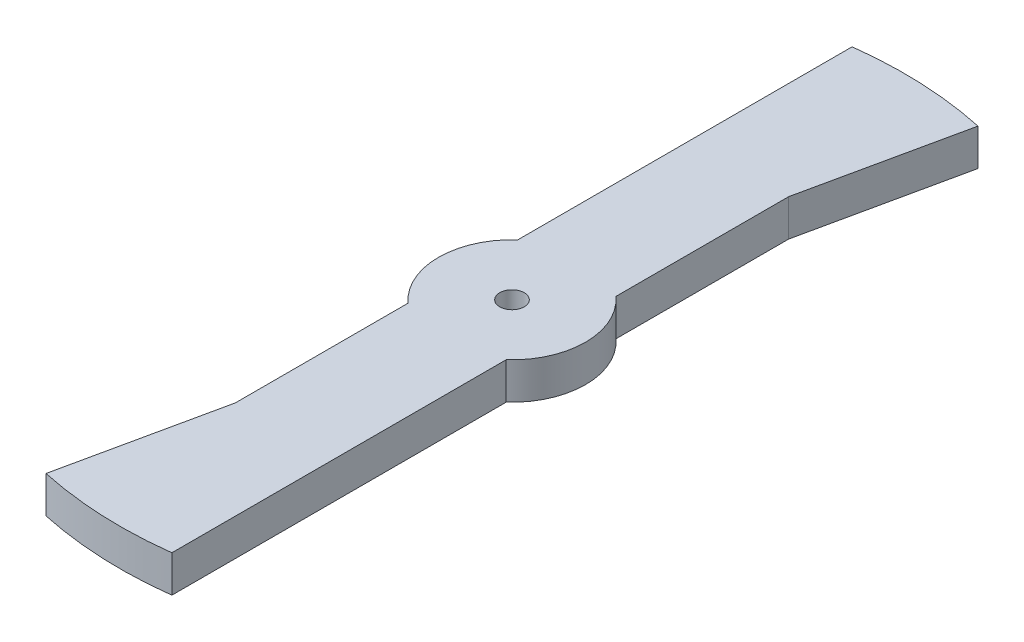
ISO-10303-21;
HEADER;
FILE_DESCRIPTION(('STEP AP214'),'2;1');
FILE_NAME('part.step','',(''),(''),'','','');
FILE_SCHEMA(('AUTOMOTIVE_DESIGN { 1 0 10303 214 1 1 1 1 }'));
ENDSEC;
DATA;
#1=APPLICATION_CONTEXT('core data for automotive mechanical design processes');
#2=APPLICATION_PROTOCOL_DEFINITION('international standard','automotive_design',2000,#1);
#3=PRODUCT_CONTEXT('',#1,'mechanical');
#4=PRODUCT('Part','Part','',(#3));
#5=PRODUCT_RELATED_PRODUCT_CATEGORY('part','',(#4));
#6=PRODUCT_DEFINITION_FORMATION('','',#4);
#7=PRODUCT_DEFINITION_CONTEXT('part definition',#1,'design');
#8=PRODUCT_DEFINITION('design','',#6,#7);
#9=PRODUCT_DEFINITION_SHAPE('','',#8);
#10=(LENGTH_UNIT() NAMED_UNIT(*) SI_UNIT(.MILLI.,.METRE.));
#11=(NAMED_UNIT(*) PLANE_ANGLE_UNIT() SI_UNIT($,.RADIAN.));
#12=(NAMED_UNIT(*) SI_UNIT($,.STERADIAN.) SOLID_ANGLE_UNIT());
#13=UNCERTAINTY_MEASURE_WITH_UNIT(LENGTH_MEASURE(1.E-05),#10,'distance_accuracy_value','');
#14=(GEOMETRIC_REPRESENTATION_CONTEXT(3) GLOBAL_UNCERTAINTY_ASSIGNED_CONTEXT((#13)) GLOBAL_UNIT_ASSIGNED_CONTEXT((#10,
#11,#12)) REPRESENTATION_CONTEXT('',''));
#15=CARTESIAN_POINT('',(0.,0.,0.));
#16=DIRECTION('',(0.,0.,1.));
#17=DIRECTION('',(1.,0.,0.));
#18=AXIS2_PLACEMENT_3D('',#15,#16,#17);
#19=CARTESIAN_POINT('',(0.,9.525,0.));
#20=DIRECTION('',(0.,-1.,0.));
#21=DIRECTION('',(0.,0.,-1.));
#22=AXIS2_PLACEMENT_3D('',#19,#20,#21);
#23=CYLINDRICAL_SURFACE('',#22,19.05);
#24=CARTESIAN_POINT('',(0.,0.,0.));
#25=DIRECTION('',(0.,1.,0.));
#26=DIRECTION('',(0.,0.,1.));
#27=AXIS2_PLACEMENT_3D('',#24,#25,#26);
#28=CIRCLE('',#27,19.05);
#29=CARTESIAN_POINT('',(12.7,0.,-14.1990316571237));
#30=VERTEX_POINT('',#29);
#31=CARTESIAN_POINT('',(12.6999999999999,0.,14.1990316571238));
#32=VERTEX_POINT('',#31);
#33=EDGE_CURVE('E149',#30,#32,#28,.F.);
#34=ORIENTED_EDGE('',*,*,#33,.F.);
#35=DIRECTION('',(0.,-1.,0.));
#36=VECTOR('',#35,1.);
#37=CARTESIAN_POINT('',(12.7,9.525,-14.1990316571237));
#38=LINE('',#37,#36);
#39=CARTESIAN_POINT('',(12.7,9.525,-14.1990316571237));
#40=VERTEX_POINT('',#39);
#41=EDGE_CURVE('E11',#40,#30,#38,.T.);
#42=ORIENTED_EDGE('',*,*,#41,.F.);
#43=CARTESIAN_POINT('',(0.,9.525,0.));
#44=DIRECTION('',(0.,1.,0.));
#45=DIRECTION('',(0.,0.,1.));
#46=AXIS2_PLACEMENT_3D('',#43,#44,#45);
#47=CIRCLE('',#46,19.05);
#48=CARTESIAN_POINT('',(12.6999999999999,9.525,14.1990316571238));
#49=VERTEX_POINT('',#48);
#50=EDGE_CURVE('E174',#40,#49,#47,.F.);
#51=ORIENTED_EDGE('',*,*,#50,.T.);
#52=DIRECTION('',(0.,-1.,0.));
#53=VECTOR('',#52,1.);
#54=CARTESIAN_POINT('',(12.6999999999999,9.525,14.1990316571238));
#55=LINE('',#54,#53);
#56=EDGE_CURVE('E95',#49,#32,#55,.T.);
#57=ORIENTED_EDGE('',*,*,#56,.T.);
#58=EDGE_LOOP('',(#34,#42,#51,#57));
#59=FACE_BOUND('',#58,.T.);
#60=ADVANCED_FACE('F39',(#59),#23,.T.);
#61=CARTESIAN_POINT('',(12.7,9.525,0.));
#62=DIRECTION('',(-1.,0.,0.));
#63=DIRECTION('',(0.,0.,1.));
#64=AXIS2_PLACEMENT_3D('',#61,#62,#63);
#65=PLANE('',#64);
#66=DIRECTION('',(0.,0.,-1.));
#67=VECTOR('',#66,1.);
#68=CARTESIAN_POINT('',(12.7,0.,0.));
#69=LINE('',#68,#67);
#70=CARTESIAN_POINT('',(12.7,0.,-58.9730075966963));
#71=VERTEX_POINT('',#70);
#72=EDGE_CURVE('E152',#30,#71,#69,.T.);
#73=ORIENTED_EDGE('',*,*,#72,.T.);
#74=DIRECTION('',(0.,-1.,0.));
#75=VECTOR('',#74,1.);
#76=CARTESIAN_POINT('',(12.7,9.525,-58.9730075966963));
#77=LINE('',#76,#75);
#78=CARTESIAN_POINT('',(12.7,9.525,-58.9730075966963));
#79=VERTEX_POINT('',#78);
#80=EDGE_CURVE('E47',#79,#71,#77,.T.);
#81=ORIENTED_EDGE('',*,*,#80,.F.);
#82=DIRECTION('',(0.,0.,-1.));
#83=VECTOR('',#82,1.);
#84=CARTESIAN_POINT('',(12.7,9.525,0.));
#85=LINE('',#84,#83);
#86=EDGE_CURVE('E213',#40,#79,#85,.T.);
#87=ORIENTED_EDGE('',*,*,#86,.F.);
#88=ORIENTED_EDGE('',*,*,#41,.T.);
#89=EDGE_LOOP('',(#73,#81,#87,#88));
#90=FACE_BOUND('',#89,.T.);
#91=ADVANCED_FACE('F227',(#90),#65,.F.);
#92=CARTESIAN_POINT('',(0.,9.525,0.));
#93=DIRECTION('',(-0.9775881905793,0.,-0.210526315789475));
#94=DIRECTION('',(-0.210526315789475,0.,0.9775881905793));
#95=AXIS2_PLACEMENT_3D('',#92,#93,#94);
#96=PLANE('',#95);
#97=DIRECTION('',(0.210526315789475,0.,-0.9775881905793));
#98=VECTOR('',#97,1.);
#99=CARTESIAN_POINT('',(0.,0.,0.));
#100=LINE('',#99,#98);
#101=CARTESIAN_POINT('',(21.3894736842106,0.,-99.3229601628569));
#102=VERTEX_POINT('',#101);
#103=EDGE_CURVE('E154',#71,#102,#100,.T.);
#104=ORIENTED_EDGE('',*,*,#103,.T.);
#105=DIRECTION('',(0.,-1.,0.));
#106=VECTOR('',#105,1.);
#107=CARTESIAN_POINT('',(21.3894736842106,9.525,-99.3229601628569));
#108=LINE('',#107,#106);
#109=CARTESIAN_POINT('',(21.3894736842106,9.525,-99.3229601628569));
#110=VERTEX_POINT('',#109);
#111=EDGE_CURVE('E186',#110,#102,#108,.T.);
#112=ORIENTED_EDGE('',*,*,#111,.F.);
#113=DIRECTION('',(0.210526315789475,0.,-0.9775881905793));
#114=VECTOR('',#113,1.);
#115=CARTESIAN_POINT('',(0.,9.525,0.));
#116=LINE('',#115,#114);
#117=EDGE_CURVE('E194',#79,#110,#116,.T.);
#118=ORIENTED_EDGE('',*,*,#117,.F.);
#119=ORIENTED_EDGE('',*,*,#80,.T.);
#120=EDGE_LOOP('',(#104,#112,#118,#119));
#121=FACE_BOUND('',#120,.T.);
#122=ADVANCED_FACE('F192',(#121),#96,.F.);
#123=CARTESIAN_POINT('',(0.,9.525,0.));
#124=DIRECTION('',(0.,-1.,0.));
#125=DIRECTION('',(0.,0.,-1.));
#126=AXIS2_PLACEMENT_3D('',#123,#124,#125);
#127=CYLINDRICAL_SURFACE('',#126,101.6);
#128=CARTESIAN_POINT('',(0.,0.,0.));
#129=DIRECTION('',(0.,1.,0.));
#130=DIRECTION('',(0.,0.,1.));
#131=AXIS2_PLACEMENT_3D('',#128,#129,#130);
#132=CIRCLE('',#131,101.6);
#133=CARTESIAN_POINT('',(-12.7,0.,-100.803124951561));
#134=VERTEX_POINT('',#133);
#135=EDGE_CURVE('E157',#134,#102,#132,.F.);
#136=ORIENTED_EDGE('',*,*,#135,.F.);
#137=DIRECTION('',(0.,-1.,0.));
#138=VECTOR('',#137,1.);
#139=CARTESIAN_POINT('',(-12.7,9.525,-100.803124951561));
#140=LINE('',#139,#138);
#141=CARTESIAN_POINT('',(-12.7,9.525,-100.803124951561));
#142=VERTEX_POINT('',#141);
#143=EDGE_CURVE('E184',#142,#134,#140,.T.);
#144=ORIENTED_EDGE('',*,*,#143,.F.);
#145=CARTESIAN_POINT('',(0.,9.525,0.));
#146=DIRECTION('',(0.,1.,0.));
#147=DIRECTION('',(0.,0.,1.));
#148=AXIS2_PLACEMENT_3D('',#145,#146,#147);
#149=CIRCLE('',#148,101.6);
#150=EDGE_CURVE('E208',#142,#110,#149,.F.);
#151=ORIENTED_EDGE('',*,*,#150,.T.);
#152=ORIENTED_EDGE('',*,*,#111,.T.);
#153=EDGE_LOOP('',(#136,#144,#151,#152));
#154=FACE_BOUND('',#153,.T.);
#155=ADVANCED_FACE('F204',(#154),#127,.T.);
#156=CARTESIAN_POINT('',(-12.7,9.525,0.));
#157=DIRECTION('',(1.,0.,0.));
#158=DIRECTION('',(0.,0.,-1.));
#159=AXIS2_PLACEMENT_3D('',#156,#157,#158);
#160=PLANE('',#159);
#161=DIRECTION('',(0.,0.,1.));
#162=VECTOR('',#161,1.);
#163=CARTESIAN_POINT('',(-12.7,0.,0.));
#164=LINE('',#163,#162);
#165=CARTESIAN_POINT('',(-12.7,0.,-14.1990316571237));
#166=VERTEX_POINT('',#165);
#167=EDGE_CURVE('E160',#134,#166,#164,.T.);
#168=ORIENTED_EDGE('',*,*,#167,.T.);
#169=DIRECTION('',(0.,-1.,0.));
#170=VECTOR('',#169,1.);
#171=CARTESIAN_POINT('',(-12.7,9.525,-14.1990316571237));
#172=LINE('',#171,#170);
#173=CARTESIAN_POINT('',(-12.7,9.525,-14.1990316571237));
#174=VERTEX_POINT('',#173);
#175=EDGE_CURVE('E181',#174,#166,#172,.T.);
#176=ORIENTED_EDGE('',*,*,#175,.F.);
#177=DIRECTION('',(0.,0.,1.));
#178=VECTOR('',#177,1.);
#179=CARTESIAN_POINT('',(-12.7,9.525,0.));
#180=LINE('',#179,#178);
#181=EDGE_CURVE('E209',#142,#174,#180,.T.);
#182=ORIENTED_EDGE('',*,*,#181,.F.);
#183=ORIENTED_EDGE('',*,*,#143,.T.);
#184=EDGE_LOOP('',(#168,#176,#182,#183));
#185=FACE_BOUND('',#184,.T.);
#186=ADVANCED_FACE('F237',(#185),#160,.F.);
#187=CARTESIAN_POINT('',(0.,9.525,0.));
#188=DIRECTION('',(0.,-1.,0.));
#189=DIRECTION('',(0.,0.,-1.));
#190=AXIS2_PLACEMENT_3D('',#187,#188,#189);
#191=CYLINDRICAL_SURFACE('',#190,19.05);
#192=CARTESIAN_POINT('',(0.,0.,0.));
#193=DIRECTION('',(0.,1.,0.));
#194=DIRECTION('',(0.,0.,1.));
#195=AXIS2_PLACEMENT_3D('',#192,#193,#194);
#196=CIRCLE('',#195,19.05);
#197=CARTESIAN_POINT('',(-12.7000000000001,0.,14.1990316571236));
#198=VERTEX_POINT('',#197);
#199=EDGE_CURVE('E162',#166,#198,#196,.T.);
#200=ORIENTED_EDGE('',*,*,#199,.T.);
#201=DIRECTION('',(0.,-1.,0.));
#202=VECTOR('',#201,1.);
#203=CARTESIAN_POINT('',(-12.7000000000001,9.525,14.1990316571236));
#204=LINE('',#203,#202);
#205=CARTESIAN_POINT('',(-12.7000000000001,9.525,14.1990316571236));
#206=VERTEX_POINT('',#205);
#207=EDGE_CURVE('E178',#206,#198,#204,.T.);
#208=ORIENTED_EDGE('',*,*,#207,.F.);
#209=CARTESIAN_POINT('',(0.,9.525,0.));
#210=DIRECTION('',(0.,1.,0.));
#211=DIRECTION('',(0.,0.,1.));
#212=AXIS2_PLACEMENT_3D('',#209,#210,#211);
#213=CIRCLE('',#212,19.05);
#214=EDGE_CURVE('E211',#174,#206,#213,.T.);
#215=ORIENTED_EDGE('',*,*,#214,.F.);
#216=ORIENTED_EDGE('',*,*,#175,.T.);
#217=EDGE_LOOP('',(#200,#208,#215,#216));
#218=FACE_BOUND('',#217,.T.);
#219=ADVANCED_FACE('F221',(#218),#191,.T.);
#220=CARTESIAN_POINT('',(-12.7000000000001,9.525,0.));
#221=DIRECTION('',(1.,0.,0.));
#222=DIRECTION('',(0.,0.,-1.));
#223=AXIS2_PLACEMENT_3D('',#220,#221,#222);
#224=PLANE('',#223);
#225=DIRECTION('',(0.,0.,1.));
#226=VECTOR('',#225,1.);
#227=CARTESIAN_POINT('',(-12.7000000000001,0.,0.));
#228=LINE('',#227,#226);
#229=CARTESIAN_POINT('',(-12.7,0.,58.9730075966963));
#230=VERTEX_POINT('',#229);
#231=EDGE_CURVE('E164',#198,#230,#228,.T.);
#232=ORIENTED_EDGE('',*,*,#231,.T.);
#233=DIRECTION('',(0.,-1.,0.));
#234=VECTOR('',#233,1.);
#235=CARTESIAN_POINT('',(-12.7,9.525,58.9730075966963));
#236=LINE('',#235,#234);
#237=CARTESIAN_POINT('',(-12.7,9.525,58.9730075966963));
#238=VERTEX_POINT('',#237);
#239=EDGE_CURVE('E139',#238,#230,#236,.T.);
#240=ORIENTED_EDGE('',*,*,#239,.F.);
#241=DIRECTION('',(0.,0.,1.));
#242=VECTOR('',#241,1.);
#243=CARTESIAN_POINT('',(-12.7000000000001,9.525,0.));
#244=LINE('',#243,#242);
#245=EDGE_CURVE('E126',#206,#238,#244,.T.);
#246=ORIENTED_EDGE('',*,*,#245,.F.);
#247=ORIENTED_EDGE('',*,*,#207,.T.);
#248=EDGE_LOOP('',(#232,#240,#246,#247));
#249=FACE_BOUND('',#248,.T.);
#250=ADVANCED_FACE('F224',(#249),#224,.F.);
#251=CARTESIAN_POINT('',(0.,9.525,0.));
#252=DIRECTION('',(0.9775881905793,0.,0.210526315789475));
#253=DIRECTION('',(0.210526315789475,0.,-0.9775881905793));
#254=AXIS2_PLACEMENT_3D('',#251,#252,#253);
#255=PLANE('',#254);
#256=DIRECTION('',(-0.210526315789475,0.,0.9775881905793));
#257=VECTOR('',#256,1.);
#258=CARTESIAN_POINT('',(0.,0.,0.));
#259=LINE('',#258,#257);
#260=CARTESIAN_POINT('',(-21.3894736842106,0.,99.3229601628569));
#261=VERTEX_POINT('',#260);
#262=EDGE_CURVE('E135',#230,#261,#259,.T.);
#263=ORIENTED_EDGE('',*,*,#262,.T.);
#264=DIRECTION('',(0.,-1.,0.));
#265=VECTOR('',#264,1.);
#266=CARTESIAN_POINT('',(-21.3894736842106,9.525,99.3229601628569));
#267=LINE('',#266,#265);
#268=CARTESIAN_POINT('',(-21.3894736842106,9.525,99.3229601628569));
#269=VERTEX_POINT('',#268);
#270=EDGE_CURVE('E132',#269,#261,#267,.T.);
#271=ORIENTED_EDGE('',*,*,#270,.F.);
#272=DIRECTION('',(-0.210526315789475,0.,0.9775881905793));
#273=VECTOR('',#272,1.);
#274=CARTESIAN_POINT('',(0.,9.525,0.));
#275=LINE('',#274,#273);
#276=EDGE_CURVE('E119',#238,#269,#275,.T.);
#277=ORIENTED_EDGE('',*,*,#276,.F.);
#278=ORIENTED_EDGE('',*,*,#239,.T.);
#279=EDGE_LOOP('',(#263,#271,#277,#278));
#280=FACE_BOUND('',#279,.T.);
#281=ADVANCED_FACE('F133',(#280),#255,.F.);
#282=CARTESIAN_POINT('',(0.,9.525,0.));
#283=DIRECTION('',(0.,-1.,0.));
#284=DIRECTION('',(0.,0.,-1.));
#285=AXIS2_PLACEMENT_3D('',#282,#283,#284);
#286=CYLINDRICAL_SURFACE('',#285,101.6);
#287=CARTESIAN_POINT('',(0.,0.,0.));
#288=DIRECTION('',(0.,1.,0.));
#289=DIRECTION('',(0.,0.,1.));
#290=AXIS2_PLACEMENT_3D('',#287,#288,#289);
#291=CIRCLE('',#290,101.6);
#292=CARTESIAN_POINT('',(12.6999999999999,0.,100.803124951561));
#293=VERTEX_POINT('',#292);
#294=EDGE_CURVE('E167',#293,#261,#291,.F.);
#295=ORIENTED_EDGE('',*,*,#294,.F.);
#296=DIRECTION('',(0.,-1.,0.));
#297=VECTOR('',#296,1.);
#298=CARTESIAN_POINT('',(12.6999999999999,9.525,100.803124951561));
#299=LINE('',#298,#297);
#300=CARTESIAN_POINT('',(12.6999999999999,9.525,100.803124951561));
#301=VERTEX_POINT('',#300);
#302=EDGE_CURVE('E88',#301,#293,#299,.T.);
#303=ORIENTED_EDGE('',*,*,#302,.F.);
#304=CARTESIAN_POINT('',(0.,9.525,0.));
#305=DIRECTION('',(0.,1.,0.));
#306=DIRECTION('',(0.,0.,1.));
#307=AXIS2_PLACEMENT_3D('',#304,#305,#306);
#308=CIRCLE('',#307,101.6);
#309=EDGE_CURVE('E124',#301,#269,#308,.F.);
#310=ORIENTED_EDGE('',*,*,#309,.T.);
#311=ORIENTED_EDGE('',*,*,#270,.T.);
#312=EDGE_LOOP('',(#295,#303,#310,#311));
#313=FACE_BOUND('',#312,.T.);
#314=ADVANCED_FACE('F141',(#313),#286,.T.);
#315=CARTESIAN_POINT('',(12.6999999999999,9.525,0.));
#316=DIRECTION('',(-1.,0.,0.));
#317=DIRECTION('',(0.,0.,1.));
#318=AXIS2_PLACEMENT_3D('',#315,#316,#317);
#319=PLANE('',#318);
#320=DIRECTION('',(0.,0.,-1.));
#321=VECTOR('',#320,1.);
#322=CARTESIAN_POINT('',(12.6999999999999,0.,0.));
#323=LINE('',#322,#321);
#324=EDGE_CURVE('E169',#293,#32,#323,.T.);
#325=ORIENTED_EDGE('',*,*,#324,.T.);
#326=ORIENTED_EDGE('',*,*,#56,.F.);
#327=DIRECTION('',(0.,0.,-1.));
#328=VECTOR('',#327,1.);
#329=CARTESIAN_POINT('',(12.6999999999999,9.525,0.));
#330=LINE('',#329,#328);
#331=EDGE_CURVE('E55',#301,#49,#330,.T.);
#332=ORIENTED_EDGE('',*,*,#331,.F.);
#333=ORIENTED_EDGE('',*,*,#302,.T.);
#334=EDGE_LOOP('',(#325,#326,#332,#333));
#335=FACE_BOUND('',#334,.T.);
#336=ADVANCED_FACE('F225',(#335),#319,.F.);
#337=CARTESIAN_POINT('',(0.,9.525,0.));
#338=DIRECTION('',(0.,-1.,0.));
#339=DIRECTION('',(0.,0.,-1.));
#340=AXIS2_PLACEMENT_3D('',#337,#338,#339);
#341=CYLINDRICAL_SURFACE('',#340,3.175);
#342=CARTESIAN_POINT('',(0.,9.525,0.));
#343=DIRECTION('',(0.,1.,0.));
#344=DIRECTION('',(0.,0.,1.));
#345=AXIS2_PLACEMENT_3D('',#342,#343,#344);
#346=CIRCLE('',#345,3.175);
#347=CARTESIAN_POINT('',(0.,9.525,-3.175));
#348=VERTEX_POINT('',#347);
#349=EDGE_CURVE('E143',#348,#348,#346,.T.);
#350=CARTESIAN_POINT('',(0.,0.,0.));
#351=DIRECTION('',(0.,1.,0.));
#352=DIRECTION('',(0.,0.,1.));
#353=AXIS2_PLACEMENT_3D('',#350,#351,#352);
#354=CIRCLE('',#353,3.175);
#355=CARTESIAN_POINT('',(0.,0.,-3.175));
#356=VERTEX_POINT('',#355);
#357=EDGE_CURVE('E171',#356,#356,#354,.T.);
#358=CARTESIAN_POINT('',(0.,9.525,-3.175));
#359=CARTESIAN_POINT('',(0.,9.42578125,-3.175));
#360=CARTESIAN_POINT('',(0.,9.3265625,-3.175));
#361=CARTESIAN_POINT('',(0.,9.128125,-3.175));
#362=CARTESIAN_POINT('',(0.,9.02890625,-3.175));
#363=CARTESIAN_POINT('',(0.,8.83046875,-3.175));
#364=CARTESIAN_POINT('',(0.,8.73125,-3.175));
#365=CARTESIAN_POINT('',(0.,8.5328125,-3.175));
#366=CARTESIAN_POINT('',(0.,8.43359375,-3.175));
#367=CARTESIAN_POINT('',(0.,8.23515625,-3.175));
#368=CARTESIAN_POINT('',(0.,8.1359375,-3.175));
#369=CARTESIAN_POINT('',(0.,7.9375,-3.175));
#370=CARTESIAN_POINT('',(0.,7.83828125,-3.175));
#371=CARTESIAN_POINT('',(0.,7.63984375,-3.175));
#372=CARTESIAN_POINT('',(0.,7.540625,-3.175));
#373=CARTESIAN_POINT('',(0.,7.3421875,-3.175));
#374=CARTESIAN_POINT('',(0.,7.24296875,-3.175));
#375=CARTESIAN_POINT('',(0.,7.04453125,-3.175));
#376=CARTESIAN_POINT('',(0.,6.9453125,-3.175));
#377=CARTESIAN_POINT('',(0.,6.746875,-3.175));
#378=CARTESIAN_POINT('',(0.,6.64765625,-3.175));
#379=CARTESIAN_POINT('',(0.,6.44921875,-3.175));
#380=CARTESIAN_POINT('',(0.,6.35,-3.175));
#381=CARTESIAN_POINT('',(0.,6.1515625,-3.175));
#382=CARTESIAN_POINT('',(0.,6.05234375,-3.175));
#383=CARTESIAN_POINT('',(0.,5.85390625,-3.175));
#384=CARTESIAN_POINT('',(0.,5.7546875,-3.175));
#385=CARTESIAN_POINT('',(0.,5.55625,-3.175));
#386=CARTESIAN_POINT('',(0.,5.45703125,-3.175));
#387=CARTESIAN_POINT('',(0.,5.25859375,-3.175));
#388=CARTESIAN_POINT('',(0.,5.159375,-3.175));
#389=CARTESIAN_POINT('',(0.,4.9609375,-3.175));
#390=CARTESIAN_POINT('',(0.,4.86171875,-3.175));
#391=CARTESIAN_POINT('',(0.,4.66328125,-3.175));
#392=CARTESIAN_POINT('',(0.,4.5640625,-3.175));
#393=CARTESIAN_POINT('',(0.,4.365625,-3.175));
#394=CARTESIAN_POINT('',(0.,4.26640625,-3.175));
#395=CARTESIAN_POINT('',(0.,4.06796875,-3.175));
#396=CARTESIAN_POINT('',(0.,3.96875,-3.175));
#397=CARTESIAN_POINT('',(0.,3.7703125,-3.175));
#398=CARTESIAN_POINT('',(0.,3.67109375,-3.175));
#399=CARTESIAN_POINT('',(0.,3.47265625,-3.175));
#400=CARTESIAN_POINT('',(0.,3.3734375,-3.175));
#401=CARTESIAN_POINT('',(0.,3.175,-3.175));
#402=CARTESIAN_POINT('',(0.,3.07578125,-3.175));
#403=CARTESIAN_POINT('',(0.,2.87734375,-3.175));
#404=CARTESIAN_POINT('',(0.,2.778125,-3.175));
#405=CARTESIAN_POINT('',(0.,2.5796875,-3.175));
#406=CARTESIAN_POINT('',(0.,2.48046875,-3.175));
#407=CARTESIAN_POINT('',(0.,2.28203125,-3.175));
#408=CARTESIAN_POINT('',(0.,2.1828125,-3.175));
#409=CARTESIAN_POINT('',(0.,1.984375,-3.175));
#410=CARTESIAN_POINT('',(0.,1.88515625,-3.175));
#411=CARTESIAN_POINT('',(0.,1.68671875,-3.175));
#412=CARTESIAN_POINT('',(0.,1.5875,-3.175));
#413=CARTESIAN_POINT('',(0.,1.3890625,-3.175));
#414=CARTESIAN_POINT('',(0.,1.28984375,-3.175));
#415=CARTESIAN_POINT('',(0.,1.09140625,-3.175));
#416=CARTESIAN_POINT('',(0.,0.992187500000001,-3.175));
#417=CARTESIAN_POINT('',(0.,0.793750000000001,-3.175));
#418=CARTESIAN_POINT('',(0.,0.69453125,-3.175));
#419=CARTESIAN_POINT('',(0.,0.49609375,-3.175));
#420=CARTESIAN_POINT('',(0.,0.396875,-3.175));
#421=CARTESIAN_POINT('',(0.,0.1984375,-3.175));
#422=CARTESIAN_POINT('',(0.,0.0992187500000001,-3.175));
#423=CARTESIAN_POINT('',(0.,0.,-3.175));
#424=B_SPLINE_CURVE_WITH_KNOTS('',3,(#358,#359,#360,#361,#362,#363,#364,#365,#366,#367,#368,
#369,#370,#371,#372,#373,#374,#375,#376,#377,#378,#379,#380,#381,#382,#383,#384,#385,#386,#387,
#388,#389,#390,#391,#392,#393,#394,#395,#396,#397,#398,#399,#400,#401,#402,#403,#404,#405,#406,
#407,#408,#409,#410,#411,#412,#413,#414,#415,#416,#417,#418,#419,#420,#421,#422,#423),
.UNSPECIFIED.,.F.,.F.,(4,2,2,2,2,2,2,2,2,2,2,2,2,2,2,2,2,2,2,2,2,2,2,2,2,2,2,2,2,2,2,2,4),(0.,
0.29765625,0.5953125,0.892968750000001,1.190625,1.48828125,1.7859375,2.08359375,2.38125,
2.67890625,2.9765625,3.27421875,3.571875,3.86953125,4.1671875,4.46484375,4.7625,5.06015625,
5.3578125,5.65546875,5.953125,6.25078125,6.5484375,6.84609375,7.14375,7.44140625,7.7390625,
8.03671875,8.334375,8.63203125,8.9296875,9.22734375,9.525),.UNSPECIFIED.);
#425=EDGE_CURVE('BSEAM251',#348,#356,#424,.T.);
#426=ORIENTED_EDGE('',*,*,#349,.T.);
#427=ORIENTED_EDGE('',*,*,#357,.F.);
#428=ORIENTED_EDGE('',*,*,#425,.T.);
#429=ORIENTED_EDGE('',*,*,#425,.F.);
#430=EDGE_LOOP('',(#426,#428,#427,#429));
#431=FACE_BOUND('',#430,.T.);
#432=ADVANCED_FACE('F251',(#431),#341,.F.);
#433=CARTESIAN_POINT('',(0.,9.525,0.));
#434=DIRECTION('',(0.,1.,0.));
#435=DIRECTION('',(0.,0.,1.));
#436=AXIS2_PLACEMENT_3D('',#433,#434,#435);
#437=PLANE('',#436);
#438=ORIENTED_EDGE('',*,*,#50,.F.);
#439=ORIENTED_EDGE('',*,*,#86,.T.);
#440=ORIENTED_EDGE('',*,*,#117,.T.);
#441=ORIENTED_EDGE('',*,*,#150,.F.);
#442=ORIENTED_EDGE('',*,*,#181,.T.);
#443=ORIENTED_EDGE('',*,*,#214,.T.);
#444=ORIENTED_EDGE('',*,*,#245,.T.);
#445=ORIENTED_EDGE('',*,*,#276,.T.);
#446=ORIENTED_EDGE('',*,*,#309,.F.);
#447=ORIENTED_EDGE('',*,*,#331,.T.);
#448=EDGE_LOOP('',(#438,#439,#440,#441,#442,#443,#444,#445,#446,#447));
#449=FACE_BOUND('',#448,.T.);
#450=ORIENTED_EDGE('',*,*,#349,.F.);
#451=EDGE_LOOP('',(#450));
#452=FACE_BOUND('',#451,.T.);
#453=ADVANCED_FACE('F121',(#449,#452),#437,.T.);
#454=CARTESIAN_POINT('',(0.,0.,0.));
#455=DIRECTION('',(0.,1.,0.));
#456=DIRECTION('',(0.,0.,1.));
#457=AXIS2_PLACEMENT_3D('',#454,#455,#456);
#458=PLANE('',#457);
#459=ORIENTED_EDGE('',*,*,#33,.T.);
#460=ORIENTED_EDGE('',*,*,#324,.F.);
#461=ORIENTED_EDGE('',*,*,#294,.T.);
#462=ORIENTED_EDGE('',*,*,#262,.F.);
#463=ORIENTED_EDGE('',*,*,#231,.F.);
#464=ORIENTED_EDGE('',*,*,#199,.F.);
#465=ORIENTED_EDGE('',*,*,#167,.F.);
#466=ORIENTED_EDGE('',*,*,#135,.T.);
#467=ORIENTED_EDGE('',*,*,#103,.F.);
#468=ORIENTED_EDGE('',*,*,#72,.F.);
#469=EDGE_LOOP('',(#459,#460,#461,#462,#463,#464,#465,#466,#467,#468));
#470=FACE_BOUND('',#469,.T.);
#471=ORIENTED_EDGE('',*,*,#357,.T.);
#472=EDGE_LOOP('',(#471));
#473=FACE_BOUND('',#472,.T.);
#474=ADVANCED_FACE('F198',(#470,#473),#458,.F.);
#475=CLOSED_SHELL('',(#60,#91,#122,#155,#186,#219,#250,#281,#314,#336,#432,#453,#474));
#476=MANIFOLD_SOLID_BREP('B2',#475);
#477=ADVANCED_BREP_SHAPE_REPRESENTATION('',(#18,#476),#14);
#478=SHAPE_DEFINITION_REPRESENTATION(#9,#477);
ENDSEC;
END-ISO-10303-21;
